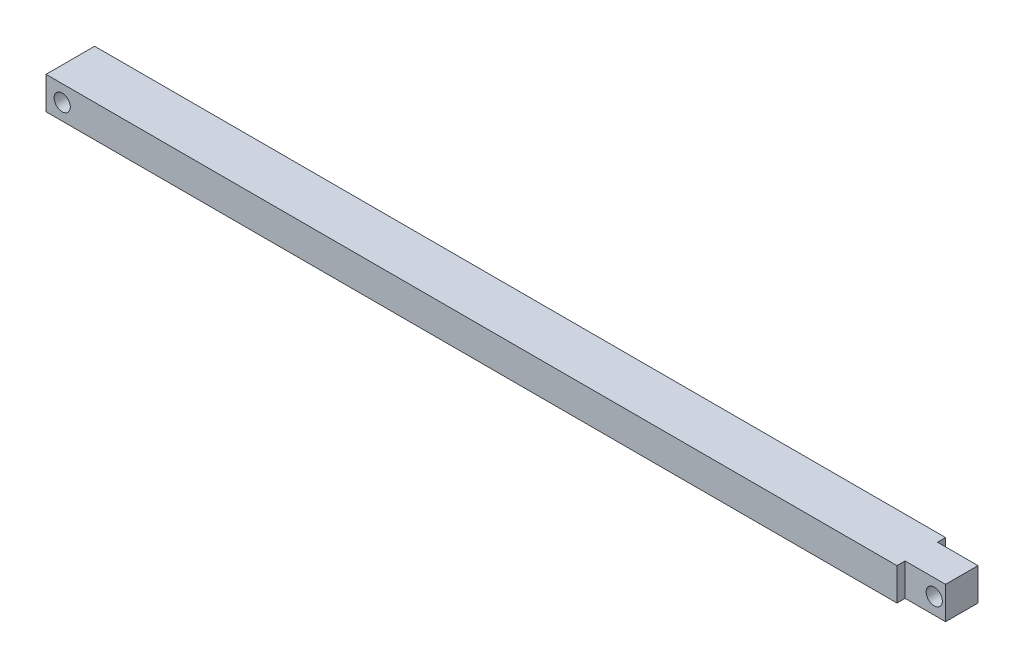
ISO-10303-21;
HEADER;
FILE_DESCRIPTION(('STEP AP214'),'2;1');
FILE_NAME('part.step','',(''),(''),'','','');
FILE_SCHEMA(('AUTOMOTIVE_DESIGN { 1 0 10303 214 1 1 1 1 }'));
ENDSEC;
DATA;
#1=APPLICATION_CONTEXT('core data for automotive mechanical design processes');
#2=APPLICATION_PROTOCOL_DEFINITION('international standard','automotive_design',2000,#1);
#3=PRODUCT_CONTEXT('',#1,'mechanical');
#4=PRODUCT('Part','Part','',(#3));
#5=PRODUCT_RELATED_PRODUCT_CATEGORY('part','',(#4));
#6=PRODUCT_DEFINITION_FORMATION('','',#4);
#7=PRODUCT_DEFINITION_CONTEXT('part definition',#1,'design');
#8=PRODUCT_DEFINITION('design','',#6,#7);
#9=PRODUCT_DEFINITION_SHAPE('','',#8);
#10=(LENGTH_UNIT() NAMED_UNIT(*) SI_UNIT(.MILLI.,.METRE.));
#11=(NAMED_UNIT(*) PLANE_ANGLE_UNIT() SI_UNIT($,.RADIAN.));
#12=(NAMED_UNIT(*) SI_UNIT($,.STERADIAN.) SOLID_ANGLE_UNIT());
#13=UNCERTAINTY_MEASURE_WITH_UNIT(LENGTH_MEASURE(1.E-05),#10,'distance_accuracy_value','');
#14=(GEOMETRIC_REPRESENTATION_CONTEXT(3) GLOBAL_UNCERTAINTY_ASSIGNED_CONTEXT((#13)) GLOBAL_UNIT_ASSIGNED_CONTEXT((#10,
#11,#12)) REPRESENTATION_CONTEXT('',''));
#15=CARTESIAN_POINT('',(0.,0.,0.));
#16=DIRECTION('',(0.,0.,1.));
#17=DIRECTION('',(1.,0.,0.));
#18=AXIS2_PLACEMENT_3D('',#15,#16,#17);
#19=CARTESIAN_POINT('',(0.,0.,-30.));
#20=DIRECTION('',(-1.,0.,0.));
#21=DIRECTION('',(0.,0.,1.));
#22=AXIS2_PLACEMENT_3D('',#19,#20,#21);
#23=PLANE('',#22);
#24=DIRECTION('',(0.,-1.,0.));
#25=VECTOR('',#24,1.);
#26=CARTESIAN_POINT('',(0.,0.,0.));
#27=LINE('',#26,#25);
#28=CARTESIAN_POINT('',(0.,20.,0.));
#29=VERTEX_POINT('',#28);
#30=CARTESIAN_POINT('',(0.,0.,0.));
#31=VERTEX_POINT('',#30);
#32=EDGE_CURVE('E151',#29,#31,#27,.T.);
#33=ORIENTED_EDGE('',*,*,#32,.F.);
#34=DIRECTION('',(0.,0.,1.));
#35=VECTOR('',#34,1.);
#36=CARTESIAN_POINT('',(0.,20.,-30.));
#37=LINE('',#36,#35);
#38=CARTESIAN_POINT('',(0.,20.,-30.));
#39=VERTEX_POINT('',#38);
#40=EDGE_CURVE('E11',#39,#29,#37,.T.);
#41=ORIENTED_EDGE('',*,*,#40,.F.);
#42=DIRECTION('',(0.,-1.,0.));
#43=VECTOR('',#42,1.);
#44=CARTESIAN_POINT('',(0.,0.,-30.));
#45=LINE('',#44,#43);
#46=CARTESIAN_POINT('',(0.,0.,-30.));
#47=VERTEX_POINT('',#46);
#48=EDGE_CURVE('E155',#39,#47,#45,.T.);
#49=ORIENTED_EDGE('',*,*,#48,.T.);
#50=DIRECTION('',(0.,0.,1.));
#51=VECTOR('',#50,1.);
#52=CARTESIAN_POINT('',(0.,0.,-30.));
#53=LINE('',#52,#51);
#54=EDGE_CURVE('E162',#47,#31,#53,.T.);
#55=ORIENTED_EDGE('',*,*,#54,.T.);
#56=EDGE_LOOP('',(#33,#41,#49,#55));
#57=FACE_BOUND('',#56,.T.);
#58=ADVANCED_FACE('F37',(#57),#23,.T.);
#59=CARTESIAN_POINT('',(0.,20.,-30.));
#60=DIRECTION('',(0.,1.,0.));
#61=DIRECTION('',(-1.,0.,0.));
#62=AXIS2_PLACEMENT_3D('',#59,#60,#61);
#63=PLANE('',#62);
#64=DIRECTION('',(1.,0.,0.));
#65=VECTOR('',#64,1.);
#66=CARTESIAN_POINT('',(550.,20.,-25.));
#67=LINE('',#66,#65);
#68=CARTESIAN_POINT('',(525.,20.,-25.));
#69=VERTEX_POINT('',#68);
#70=CARTESIAN_POINT('',(550.,20.,-25.));
#71=VERTEX_POINT('',#70);
#72=EDGE_CURVE('E124',#69,#71,#67,.T.);
#73=ORIENTED_EDGE('',*,*,#72,.F.);
#74=DIRECTION('',(0.,0.,1.));
#75=VECTOR('',#74,1.);
#76=CARTESIAN_POINT('',(525.,20.,-30.));
#77=LINE('',#76,#75);
#78=CARTESIAN_POINT('',(525.,20.,-30.));
#79=VERTEX_POINT('',#78);
#80=EDGE_CURVE('E105',#79,#69,#77,.T.);
#81=ORIENTED_EDGE('',*,*,#80,.F.);
#82=DIRECTION('',(-1.,0.,0.));
#83=VECTOR('',#82,1.);
#84=CARTESIAN_POINT('',(0.,20.,-30.));
#85=LINE('',#84,#83);
#86=EDGE_CURVE('E160',#79,#39,#85,.T.);
#87=ORIENTED_EDGE('',*,*,#86,.T.);
#88=ORIENTED_EDGE('',*,*,#40,.T.);
#89=DIRECTION('',(-1.,0.,0.));
#90=VECTOR('',#89,1.);
#91=CARTESIAN_POINT('',(0.,20.,0.));
#92=LINE('',#91,#90);
#93=CARTESIAN_POINT('',(525.,20.,0.));
#94=VERTEX_POINT('',#93);
#95=EDGE_CURVE('E158',#94,#29,#92,.T.);
#96=ORIENTED_EDGE('',*,*,#95,.F.);
#97=DIRECTION('',(0.,0.,1.));
#98=VECTOR('',#97,1.);
#99=CARTESIAN_POINT('',(525.,20.,0.));
#100=LINE('',#99,#98);
#101=CARTESIAN_POINT('',(525.,20.,-5.));
#102=VERTEX_POINT('',#101);
#103=EDGE_CURVE('E61',#102,#94,#100,.T.);
#104=ORIENTED_EDGE('',*,*,#103,.F.);
#105=DIRECTION('',(-1.,0.,0.));
#106=VECTOR('',#105,1.);
#107=CARTESIAN_POINT('',(550.,20.,-5.00000000000001));
#108=LINE('',#107,#106);
#109=CARTESIAN_POINT('',(550.,20.,-5.00000000000001));
#110=VERTEX_POINT('',#109);
#111=EDGE_CURVE('E128',#110,#102,#108,.T.);
#112=ORIENTED_EDGE('',*,*,#111,.F.);
#113=DIRECTION('',(0.,0.,1.));
#114=VECTOR('',#113,1.);
#115=CARTESIAN_POINT('',(550.,20.,-30.));
#116=LINE('',#115,#114);
#117=EDGE_CURVE('E45',#71,#110,#116,.T.);
#118=ORIENTED_EDGE('',*,*,#117,.F.);
#119=EDGE_LOOP('',(#73,#81,#87,#88,#96,#104,#112,#118));
#120=FACE_BOUND('',#119,.T.);
#121=ADVANCED_FACE('F191',(#120),#63,.T.);
#122=CARTESIAN_POINT('',(550.,0.,-30.));
#123=DIRECTION('',(1.,0.,0.));
#124=DIRECTION('',(0.,0.,-1.));
#125=AXIS2_PLACEMENT_3D('',#122,#123,#124);
#126=PLANE('',#125);
#127=DIRECTION('',(0.,1.,0.));
#128=VECTOR('',#127,1.);
#129=CARTESIAN_POINT('',(550.,0.,-25.));
#130=LINE('',#129,#128);
#131=CARTESIAN_POINT('',(550.,0.,-25.));
#132=VERTEX_POINT('',#131);
#133=EDGE_CURVE('E108',#132,#71,#130,.T.);
#134=ORIENTED_EDGE('',*,*,#133,.T.);
#135=ORIENTED_EDGE('',*,*,#117,.T.);
#136=DIRECTION('',(0.,1.,0.));
#137=VECTOR('',#136,1.);
#138=CARTESIAN_POINT('',(550.,0.,-5.00000000000001));
#139=LINE('',#138,#137);
#140=CARTESIAN_POINT('',(550.,0.,-5.00000000000001));
#141=VERTEX_POINT('',#140);
#142=EDGE_CURVE('E133',#141,#110,#139,.T.);
#143=ORIENTED_EDGE('',*,*,#142,.F.);
#144=DIRECTION('',(0.,0.,1.));
#145=VECTOR('',#144,1.);
#146=CARTESIAN_POINT('',(550.,0.,-30.));
#147=LINE('',#146,#145);
#148=EDGE_CURVE('E171',#132,#141,#147,.T.);
#149=ORIENTED_EDGE('',*,*,#148,.F.);
#150=EDGE_LOOP('',(#134,#135,#143,#149));
#151=FACE_BOUND('',#150,.T.);
#152=ADVANCED_FACE('F196',(#151),#126,.T.);
#153=CARTESIAN_POINT('',(0.,0.,-30.));
#154=DIRECTION('',(0.,-1.,0.));
#155=DIRECTION('',(1.,0.,0.));
#156=AXIS2_PLACEMENT_3D('',#153,#154,#155);
#157=PLANE('',#156);
#158=DIRECTION('',(1.,0.,0.));
#159=VECTOR('',#158,1.);
#160=CARTESIAN_POINT('',(550.,0.,-25.));
#161=LINE('',#160,#159);
#162=CARTESIAN_POINT('',(525.,0.,-25.));
#163=VERTEX_POINT('',#162);
#164=EDGE_CURVE('E112',#163,#132,#161,.T.);
#165=ORIENTED_EDGE('',*,*,#164,.T.);
#166=ORIENTED_EDGE('',*,*,#148,.T.);
#167=DIRECTION('',(-1.,0.,0.));
#168=VECTOR('',#167,1.);
#169=CARTESIAN_POINT('',(550.,0.,-5.00000000000001));
#170=LINE('',#169,#168);
#171=CARTESIAN_POINT('',(525.,0.,-5.));
#172=VERTEX_POINT('',#171);
#173=EDGE_CURVE('E141',#141,#172,#170,.T.);
#174=ORIENTED_EDGE('',*,*,#173,.T.);
#175=DIRECTION('',(0.,0.,1.));
#176=VECTOR('',#175,1.);
#177=CARTESIAN_POINT('',(525.,0.,0.));
#178=LINE('',#177,#176);
#179=CARTESIAN_POINT('',(525.,0.,0.));
#180=VERTEX_POINT('',#179);
#181=EDGE_CURVE('E135',#172,#180,#178,.T.);
#182=ORIENTED_EDGE('',*,*,#181,.T.);
#183=DIRECTION('',(1.,0.,0.));
#184=VECTOR('',#183,1.);
#185=CARTESIAN_POINT('',(0.,0.,0.));
#186=LINE('',#185,#184);
#187=EDGE_CURVE('E165',#31,#180,#186,.T.);
#188=ORIENTED_EDGE('',*,*,#187,.F.);
#189=ORIENTED_EDGE('',*,*,#54,.F.);
#190=DIRECTION('',(1.,0.,0.));
#191=VECTOR('',#190,1.);
#192=CARTESIAN_POINT('',(0.,0.,-30.));
#193=LINE('',#192,#191);
#194=CARTESIAN_POINT('',(525.,0.,-30.));
#195=VERTEX_POINT('',#194);
#196=EDGE_CURVE('E123',#47,#195,#193,.T.);
#197=ORIENTED_EDGE('',*,*,#196,.T.);
#198=DIRECTION('',(0.,0.,1.));
#199=VECTOR('',#198,1.);
#200=CARTESIAN_POINT('',(525.,0.,-30.));
#201=LINE('',#200,#199);
#202=EDGE_CURVE('E53',#195,#163,#201,.T.);
#203=ORIENTED_EDGE('',*,*,#202,.T.);
#204=EDGE_LOOP('',(#165,#166,#174,#182,#188,#189,#197,#203));
#205=FACE_BOUND('',#204,.T.);
#206=ADVANCED_FACE('F121',(#205),#157,.T.);
#207=CARTESIAN_POINT('',(0.,0.,-30.));
#208=DIRECTION('',(0.,0.,-1.));
#209=DIRECTION('',(-1.,0.,0.));
#210=AXIS2_PLACEMENT_3D('',#207,#208,#209);
#211=PLANE('',#210);
#212=DIRECTION('',(0.,1.,0.));
#213=VECTOR('',#212,1.);
#214=CARTESIAN_POINT('',(525.,0.,-30.));
#215=LINE('',#214,#213);
#216=EDGE_CURVE('E109',#195,#79,#215,.T.);
#217=ORIENTED_EDGE('',*,*,#216,.F.);
#218=ORIENTED_EDGE('',*,*,#196,.F.);
#219=ORIENTED_EDGE('',*,*,#48,.F.);
#220=ORIENTED_EDGE('',*,*,#86,.F.);
#221=EDGE_LOOP('',(#217,#218,#219,#220));
#222=FACE_BOUND('',#221,.T.);
#223=CARTESIAN_POINT('',(10.,10.,-30.));
#224=DIRECTION('',(0.,0.,1.));
#225=DIRECTION('',(1.,0.,0.));
#226=AXIS2_PLACEMENT_3D('',#223,#224,#225);
#227=CIRCLE('',#226,5.);
#228=CARTESIAN_POINT('',(15.,10.,-30.));
#229=VERTEX_POINT('',#228);
#230=EDGE_CURVE('E148',#229,#229,#227,.T.);
#231=ORIENTED_EDGE('',*,*,#230,.T.);
#232=EDGE_LOOP('',(#231));
#233=FACE_BOUND('',#232,.T.);
#234=ADVANCED_FACE('F208',(#222,#233),#211,.T.);
#235=CARTESIAN_POINT('',(0.,0.,0.));
#236=DIRECTION('',(0.,0.,-1.));
#237=DIRECTION('',(-1.,0.,0.));
#238=AXIS2_PLACEMENT_3D('',#235,#236,#237);
#239=PLANE('',#238);
#240=CARTESIAN_POINT('',(10.,10.,0.));
#241=DIRECTION('',(0.,0.,1.));
#242=DIRECTION('',(1.,0.,0.));
#243=AXIS2_PLACEMENT_3D('',#240,#241,#242);
#244=CIRCLE('',#243,5.);
#245=CARTESIAN_POINT('',(15.,10.,0.));
#246=VERTEX_POINT('',#245);
#247=EDGE_CURVE('E152',#246,#246,#244,.T.);
#248=ORIENTED_EDGE('',*,*,#247,.F.);
#249=EDGE_LOOP('',(#248));
#250=FACE_BOUND('',#249,.T.);
#251=ORIENTED_EDGE('',*,*,#187,.T.);
#252=DIRECTION('',(0.,1.,0.));
#253=VECTOR('',#252,1.);
#254=CARTESIAN_POINT('',(525.,0.,0.));
#255=LINE('',#254,#253);
#256=EDGE_CURVE('E138',#180,#94,#255,.T.);
#257=ORIENTED_EDGE('',*,*,#256,.T.);
#258=ORIENTED_EDGE('',*,*,#95,.T.);
#259=ORIENTED_EDGE('',*,*,#32,.T.);
#260=EDGE_LOOP('',(#251,#257,#258,#259));
#261=FACE_BOUND('',#260,.T.);
#262=ADVANCED_FACE('F204',(#250,#261),#239,.F.);
#263=CARTESIAN_POINT('',(10.,10.,-30.));
#264=DIRECTION('',(0.,0.,1.));
#265=DIRECTION('',(1.,0.,0.));
#266=AXIS2_PLACEMENT_3D('',#263,#264,#265);
#267=CYLINDRICAL_SURFACE('',#266,5.);
#268=ORIENTED_EDGE('',*,*,#230,.F.);
#269=EDGE_LOOP('',(#268));
#270=FACE_BOUND('',#269,.T.);
#271=ORIENTED_EDGE('',*,*,#247,.T.);
#272=EDGE_LOOP('',(#271));
#273=FACE_BOUND('',#272,.T.);
#274=ADVANCED_FACE('F214',(#270,#273),#267,.F.);
#275=CARTESIAN_POINT('',(550.,0.,-5.00000000000001));
#276=DIRECTION('',(0.,0.,-1.));
#277=DIRECTION('',(-1.,0.,0.));
#278=AXIS2_PLACEMENT_3D('',#275,#276,#277);
#279=PLANE('',#278);
#280=ORIENTED_EDGE('',*,*,#111,.T.);
#281=DIRECTION('',(0.,1.,0.));
#282=VECTOR('',#281,1.);
#283=CARTESIAN_POINT('',(525.,0.,-5.));
#284=LINE('',#283,#282);
#285=EDGE_CURVE('E136',#172,#102,#284,.T.);
#286=ORIENTED_EDGE('',*,*,#285,.F.);
#287=ORIENTED_EDGE('',*,*,#173,.F.);
#288=ORIENTED_EDGE('',*,*,#142,.T.);
#289=EDGE_LOOP('',(#280,#286,#287,#288));
#290=FACE_BOUND('',#289,.T.);
#291=CARTESIAN_POINT('',(543.,10.,-5.00000000000001));
#292=DIRECTION('',(0.,0.,-1.));
#293=DIRECTION('',(-1.,0.,0.));
#294=AXIS2_PLACEMENT_3D('',#291,#292,#293);
#295=CIRCLE('',#294,5.00000000000004);
#296=CARTESIAN_POINT('',(538.,10.,-5.00000000000001));
#297=VERTEX_POINT('',#296);
#298=EDGE_CURVE('E130',#297,#297,#295,.F.);
#299=ORIENTED_EDGE('',*,*,#298,.F.);
#300=EDGE_LOOP('',(#299));
#301=FACE_BOUND('',#300,.T.);
#302=ADVANCED_FACE('F188',(#290,#301),#279,.F.);
#303=CARTESIAN_POINT('',(525.,0.,0.));
#304=DIRECTION('',(-1.,0.,0.));
#305=DIRECTION('',(0.,0.,1.));
#306=AXIS2_PLACEMENT_3D('',#303,#304,#305);
#307=PLANE('',#306);
#308=ORIENTED_EDGE('',*,*,#103,.T.);
#309=ORIENTED_EDGE('',*,*,#256,.F.);
#310=ORIENTED_EDGE('',*,*,#181,.F.);
#311=ORIENTED_EDGE('',*,*,#285,.T.);
#312=EDGE_LOOP('',(#308,#309,#310,#311));
#313=FACE_BOUND('',#312,.T.);
#314=ADVANCED_FACE('F181',(#313),#307,.F.);
#315=CARTESIAN_POINT('',(550.,0.,-25.));
#316=DIRECTION('',(0.,0.,1.));
#317=DIRECTION('',(1.,0.,0.));
#318=AXIS2_PLACEMENT_3D('',#315,#316,#317);
#319=PLANE('',#318);
#320=ORIENTED_EDGE('',*,*,#72,.T.);
#321=ORIENTED_EDGE('',*,*,#133,.F.);
#322=ORIENTED_EDGE('',*,*,#164,.F.);
#323=DIRECTION('',(0.,1.,0.));
#324=VECTOR('',#323,1.);
#325=CARTESIAN_POINT('',(525.,0.,-25.));
#326=LINE('',#325,#324);
#327=EDGE_CURVE('E101',#163,#69,#326,.T.);
#328=ORIENTED_EDGE('',*,*,#327,.T.);
#329=EDGE_LOOP('',(#320,#321,#322,#328));
#330=FACE_BOUND('',#329,.T.);
#331=CARTESIAN_POINT('',(543.,10.,-25.));
#332=DIRECTION('',(0.,0.,1.));
#333=DIRECTION('',(1.,0.,0.));
#334=AXIS2_PLACEMENT_3D('',#331,#332,#333);
#335=CIRCLE('',#334,5.00000000000004);
#336=CARTESIAN_POINT('',(548.,10.,-25.));
#337=VERTEX_POINT('',#336);
#338=EDGE_CURVE('E40',#337,#337,#335,.F.);
#339=ORIENTED_EDGE('',*,*,#338,.F.);
#340=EDGE_LOOP('',(#339));
#341=FACE_BOUND('',#340,.T.);
#342=ADVANCED_FACE('F113',(#330,#341),#319,.F.);
#343=CARTESIAN_POINT('',(525.,0.,-30.));
#344=DIRECTION('',(-1.,0.,0.));
#345=DIRECTION('',(0.,0.,1.));
#346=AXIS2_PLACEMENT_3D('',#343,#344,#345);
#347=PLANE('',#346);
#348=ORIENTED_EDGE('',*,*,#80,.T.);
#349=ORIENTED_EDGE('',*,*,#327,.F.);
#350=ORIENTED_EDGE('',*,*,#202,.F.);
#351=ORIENTED_EDGE('',*,*,#216,.T.);
#352=EDGE_LOOP('',(#348,#349,#350,#351));
#353=FACE_BOUND('',#352,.T.);
#354=ADVANCED_FACE('F103',(#353),#347,.F.);
#355=CARTESIAN_POINT('',(543.,10.,-30.));
#356=DIRECTION('',(0.,0.,1.));
#357=DIRECTION('',(1.,0.,0.));
#358=AXIS2_PLACEMENT_3D('',#355,#356,#357);
#359=CYLINDRICAL_SURFACE('',#358,5.00000000000004);
#360=ORIENTED_EDGE('',*,*,#338,.T.);
#361=EDGE_LOOP('',(#360));
#362=FACE_BOUND('',#361,.T.);
#363=ORIENTED_EDGE('',*,*,#298,.T.);
#364=EDGE_LOOP('',(#363));
#365=FACE_BOUND('',#364,.T.);
#366=ADVANCED_FACE('F179',(#362,#365),#359,.F.);
#367=CLOSED_SHELL('',(#58,#121,#152,#206,#234,#262,#274,#302,#314,#342,#354,#366));
#368=MANIFOLD_SOLID_BREP('B2',#367);
#369=ADVANCED_BREP_SHAPE_REPRESENTATION('',(#18,#368),#14);
#370=SHAPE_DEFINITION_REPRESENTATION(#9,#369);
ENDSEC;
END-ISO-10303-21;
